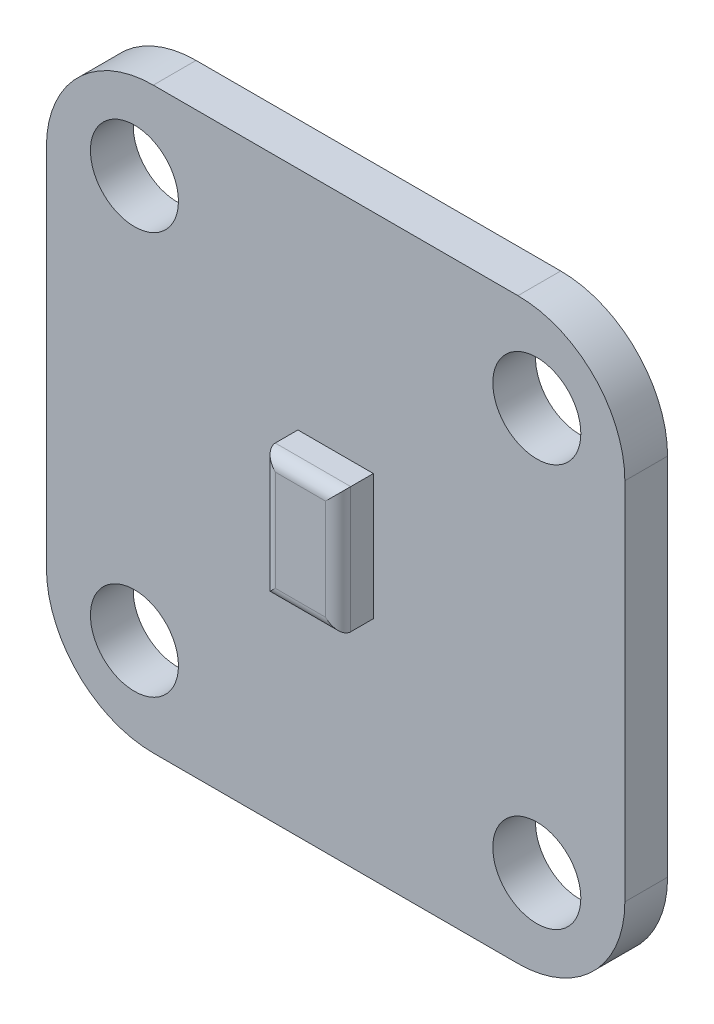
ISO-10303-21;
HEADER;
FILE_DESCRIPTION(('STEP AP214'),'2;1');
FILE_NAME('part.step','',(''),(''),'','','');
FILE_SCHEMA(('AUTOMOTIVE_DESIGN { 1 0 10303 214 1 1 1 1 }'));
ENDSEC;
DATA;
#1=APPLICATION_CONTEXT('core data for automotive mechanical design processes');
#2=APPLICATION_PROTOCOL_DEFINITION('international standard','automotive_design',2000,#1);
#3=PRODUCT_CONTEXT('',#1,'mechanical');
#4=PRODUCT('Part','Part','',(#3));
#5=PRODUCT_RELATED_PRODUCT_CATEGORY('part','',(#4));
#6=PRODUCT_DEFINITION_FORMATION('','',#4);
#7=PRODUCT_DEFINITION_CONTEXT('part definition',#1,'design');
#8=PRODUCT_DEFINITION('design','',#6,#7);
#9=PRODUCT_DEFINITION_SHAPE('','',#8);
#10=(LENGTH_UNIT() NAMED_UNIT(*) SI_UNIT(.MILLI.,.METRE.));
#11=(NAMED_UNIT(*) PLANE_ANGLE_UNIT() SI_UNIT($,.RADIAN.));
#12=(NAMED_UNIT(*) SI_UNIT($,.STERADIAN.) SOLID_ANGLE_UNIT());
#13=UNCERTAINTY_MEASURE_WITH_UNIT(LENGTH_MEASURE(1.E-05),#10,'distance_accuracy_value','');
#14=(GEOMETRIC_REPRESENTATION_CONTEXT(3) GLOBAL_UNCERTAINTY_ASSIGNED_CONTEXT((#13)) GLOBAL_UNIT_ASSIGNED_CONTEXT((#10,
#11,#12)) REPRESENTATION_CONTEXT('',''));
#15=CARTESIAN_POINT('',(0.,0.,0.));
#16=DIRECTION('',(0.,0.,1.));
#17=DIRECTION('',(1.,0.,0.));
#18=AXIS2_PLACEMENT_3D('',#15,#16,#17);
#19=CARTESIAN_POINT('',(0.,-11.5,1.7));
#20=DIRECTION('',(0.,1.,0.));
#21=DIRECTION('',(0.,0.,1.));
#22=AXIS2_PLACEMENT_3D('',#19,#20,#21);
#23=PLANE('',#22);
#24=DIRECTION('',(1.,0.,0.));
#25=VECTOR('',#24,1.);
#26=CARTESIAN_POINT('',(0.,-11.5,0.));
#27=LINE('',#26,#25);
#28=CARTESIAN_POINT('',(-7.25,-11.5,0.));
#29=VERTEX_POINT('',#28);
#30=CARTESIAN_POINT('',(7.25,-11.5,0.));
#31=VERTEX_POINT('',#30);
#32=EDGE_CURVE('E203',#29,#31,#27,.T.);
#33=ORIENTED_EDGE('',*,*,#32,.T.);
#34=DIRECTION('',(0.,0.,-1.));
#35=VECTOR('',#34,1.);
#36=CARTESIAN_POINT('',(7.25,-11.5,1.7));
#37=LINE('',#36,#35);
#38=CARTESIAN_POINT('',(7.25,-11.5,1.7));
#39=VERTEX_POINT('',#38);
#40=EDGE_CURVE('E246',#31,#39,#37,.F.);
#41=ORIENTED_EDGE('',*,*,#40,.T.);
#42=DIRECTION('',(1.,0.,0.));
#43=VECTOR('',#42,1.);
#44=CARTESIAN_POINT('',(0.,-11.5,1.7));
#45=LINE('',#44,#43);
#46=CARTESIAN_POINT('',(-7.25,-11.5,1.7));
#47=VERTEX_POINT('',#46);
#48=EDGE_CURVE('E182',#47,#39,#45,.T.);
#49=ORIENTED_EDGE('',*,*,#48,.F.);
#50=DIRECTION('',(0.,0.,-1.));
#51=VECTOR('',#50,1.);
#52=CARTESIAN_POINT('',(-7.25,-11.5,0.));
#53=LINE('',#52,#51);
#54=EDGE_CURVE('E232',#47,#29,#53,.T.);
#55=ORIENTED_EDGE('',*,*,#54,.T.);
#56=EDGE_LOOP('',(#33,#41,#49,#55));
#57=FACE_BOUND('',#56,.T.);
#58=ADVANCED_FACE('F34',(#57),#23,.F.);
#59=CARTESIAN_POINT('',(11.5,0.,1.7));
#60=DIRECTION('',(-1.,0.,0.));
#61=DIRECTION('',(0.,0.,1.));
#62=AXIS2_PLACEMENT_3D('',#59,#60,#61);
#63=PLANE('',#62);
#64=DIRECTION('',(0.,1.,0.));
#65=VECTOR('',#64,1.);
#66=CARTESIAN_POINT('',(11.5,0.,1.7));
#67=LINE('',#66,#65);
#68=CARTESIAN_POINT('',(11.5,-7.25,1.7));
#69=VERTEX_POINT('',#68);
#70=CARTESIAN_POINT('',(11.5,7.25,1.7));
#71=VERTEX_POINT('',#70);
#72=EDGE_CURVE('E185',#69,#71,#67,.T.);
#73=ORIENTED_EDGE('',*,*,#72,.F.);
#74=DIRECTION('',(0.,0.,-1.));
#75=VECTOR('',#74,1.);
#76=CARTESIAN_POINT('',(11.5,-7.25,1.7));
#77=LINE('',#76,#75);
#78=CARTESIAN_POINT('',(11.5,-7.25,0.));
#79=VERTEX_POINT('',#78);
#80=EDGE_CURVE('E241',#69,#79,#77,.T.);
#81=ORIENTED_EDGE('',*,*,#80,.T.);
#82=DIRECTION('',(0.,1.,0.));
#83=VECTOR('',#82,1.);
#84=CARTESIAN_POINT('',(11.5,0.,0.));
#85=LINE('',#84,#83);
#86=CARTESIAN_POINT('',(11.5,7.25,0.));
#87=VERTEX_POINT('',#86);
#88=EDGE_CURVE('E206',#79,#87,#85,.T.);
#89=ORIENTED_EDGE('',*,*,#88,.T.);
#90=DIRECTION('',(0.,0.,-1.));
#91=VECTOR('',#90,1.);
#92=CARTESIAN_POINT('',(11.5,7.25,1.7));
#93=LINE('',#92,#91);
#94=EDGE_CURVE('E216',#87,#71,#93,.F.);
#95=ORIENTED_EDGE('',*,*,#94,.T.);
#96=EDGE_LOOP('',(#73,#81,#89,#95));
#97=FACE_BOUND('',#96,.T.);
#98=ADVANCED_FACE('F300',(#97),#63,.F.);
#99=CARTESIAN_POINT('',(0.,11.5,1.7));
#100=DIRECTION('',(0.,1.,0.));
#101=DIRECTION('',(0.,0.,1.));
#102=AXIS2_PLACEMENT_3D('',#99,#100,#101);
#103=PLANE('',#102);
#104=DIRECTION('',(1.,0.,0.));
#105=VECTOR('',#104,1.);
#106=CARTESIAN_POINT('',(0.,11.5,0.));
#107=LINE('',#106,#105);
#108=CARTESIAN_POINT('',(-7.25,11.5,0.));
#109=VERTEX_POINT('',#108);
#110=CARTESIAN_POINT('',(7.25,11.5,0.));
#111=VERTEX_POINT('',#110);
#112=EDGE_CURVE('E208',#109,#111,#107,.T.);
#113=ORIENTED_EDGE('',*,*,#112,.F.);
#114=DIRECTION('',(0.,0.,-1.));
#115=VECTOR('',#114,1.);
#116=CARTESIAN_POINT('',(-7.25,11.5,1.7));
#117=LINE('',#116,#115);
#118=CARTESIAN_POINT('',(-7.25,11.5,1.7));
#119=VERTEX_POINT('',#118);
#120=EDGE_CURVE('E227',#109,#119,#117,.F.);
#121=ORIENTED_EDGE('',*,*,#120,.T.);
#122=DIRECTION('',(1.,0.,0.));
#123=VECTOR('',#122,1.);
#124=CARTESIAN_POINT('',(0.,11.5,1.7));
#125=LINE('',#124,#123);
#126=CARTESIAN_POINT('',(7.25,11.5,1.7));
#127=VERTEX_POINT('',#126);
#128=EDGE_CURVE('E187',#119,#127,#125,.T.);
#129=ORIENTED_EDGE('',*,*,#128,.T.);
#130=DIRECTION('',(0.,0.,-1.));
#131=VECTOR('',#130,1.);
#132=CARTESIAN_POINT('',(7.25,11.5,0.));
#133=LINE('',#132,#131);
#134=EDGE_CURVE('E191',#127,#111,#133,.T.);
#135=ORIENTED_EDGE('',*,*,#134,.T.);
#136=EDGE_LOOP('',(#113,#121,#129,#135));
#137=FACE_BOUND('',#136,.T.);
#138=ADVANCED_FACE('F306',(#137),#103,.T.);
#139=CARTESIAN_POINT('',(-8.,8.,1.7));
#140=DIRECTION('',(0.,0.,-1.));
#141=DIRECTION('',(-1.,0.,0.));
#142=AXIS2_PLACEMENT_3D('',#139,#140,#141);
#143=CYLINDRICAL_SURFACE('',#142,1.75);
#144=CARTESIAN_POINT('',(-8.,8.,1.7));
#145=DIRECTION('',(0.,0.,1.));
#146=DIRECTION('',(1.,0.,0.));
#147=AXIS2_PLACEMENT_3D('',#144,#145,#146);
#148=CIRCLE('',#147,1.75);
#149=CARTESIAN_POINT('',(-6.25,8.,1.7));
#150=VERTEX_POINT('',#149);
#151=EDGE_CURVE('E179',#150,#150,#148,.T.);
#152=ORIENTED_EDGE('',*,*,#151,.T.);
#153=EDGE_LOOP('',(#152));
#154=FACE_BOUND('',#153,.T.);
#155=CARTESIAN_POINT('',(-8.,8.,0.));
#156=DIRECTION('',(0.,0.,1.));
#157=DIRECTION('',(1.,0.,0.));
#158=AXIS2_PLACEMENT_3D('',#155,#156,#157);
#159=CIRCLE('',#158,1.75);
#160=CARTESIAN_POINT('',(-6.25,8.,0.));
#161=VERTEX_POINT('',#160);
#162=EDGE_CURVE('E200',#161,#161,#159,.T.);
#163=ORIENTED_EDGE('',*,*,#162,.F.);
#164=EDGE_LOOP('',(#163));
#165=FACE_BOUND('',#164,.T.);
#166=ADVANCED_FACE('F311',(#154,#165),#143,.F.);
#167=CARTESIAN_POINT('',(8.,-8.,1.7));
#168=DIRECTION('',(0.,0.,-1.));
#169=DIRECTION('',(-1.,0.,0.));
#170=AXIS2_PLACEMENT_3D('',#167,#168,#169);
#171=CYLINDRICAL_SURFACE('',#170,1.75);
#172=CARTESIAN_POINT('',(8.,-8.,1.7));
#173=DIRECTION('',(0.,0.,1.));
#174=DIRECTION('',(1.,0.,0.));
#175=AXIS2_PLACEMENT_3D('',#172,#173,#174);
#176=CIRCLE('',#175,1.75);
#177=CARTESIAN_POINT('',(9.75,-8.,1.7));
#178=VERTEX_POINT('',#177);
#179=EDGE_CURVE('E176',#178,#178,#176,.T.);
#180=ORIENTED_EDGE('',*,*,#179,.T.);
#181=EDGE_LOOP('',(#180));
#182=FACE_BOUND('',#181,.T.);
#183=CARTESIAN_POINT('',(8.,-8.,0.));
#184=DIRECTION('',(0.,0.,1.));
#185=DIRECTION('',(1.,0.,0.));
#186=AXIS2_PLACEMENT_3D('',#183,#184,#185);
#187=CIRCLE('',#186,1.75);
#188=CARTESIAN_POINT('',(9.75,-8.,0.));
#189=VERTEX_POINT('',#188);
#190=EDGE_CURVE('E197',#189,#189,#187,.T.);
#191=ORIENTED_EDGE('',*,*,#190,.F.);
#192=EDGE_LOOP('',(#191));
#193=FACE_BOUND('',#192,.T.);
#194=ADVANCED_FACE('F314',(#182,#193),#171,.F.);
#195=CARTESIAN_POINT('',(8.,8.,1.7));
#196=DIRECTION('',(0.,0.,-1.));
#197=DIRECTION('',(-1.,0.,0.));
#198=AXIS2_PLACEMENT_3D('',#195,#196,#197);
#199=CYLINDRICAL_SURFACE('',#198,1.75);
#200=CARTESIAN_POINT('',(8.,8.,1.7));
#201=DIRECTION('',(0.,0.,1.));
#202=DIRECTION('',(1.,0.,0.));
#203=AXIS2_PLACEMENT_3D('',#200,#201,#202);
#204=CIRCLE('',#203,1.75);
#205=CARTESIAN_POINT('',(9.75,8.,1.7));
#206=VERTEX_POINT('',#205);
#207=EDGE_CURVE('E172',#206,#206,#204,.T.);
#208=ORIENTED_EDGE('',*,*,#207,.T.);
#209=EDGE_LOOP('',(#208));
#210=FACE_BOUND('',#209,.T.);
#211=CARTESIAN_POINT('',(8.,8.,0.));
#212=DIRECTION('',(0.,0.,1.));
#213=DIRECTION('',(1.,0.,0.));
#214=AXIS2_PLACEMENT_3D('',#211,#212,#213);
#215=CIRCLE('',#214,1.75);
#216=CARTESIAN_POINT('',(9.75,8.,0.));
#217=VERTEX_POINT('',#216);
#218=EDGE_CURVE('E194',#217,#217,#215,.T.);
#219=ORIENTED_EDGE('',*,*,#218,.F.);
#220=EDGE_LOOP('',(#219));
#221=FACE_BOUND('',#220,.T.);
#222=ADVANCED_FACE('F318',(#210,#221),#199,.F.);
#223=CARTESIAN_POINT('',(-8.,-8.,1.7));
#224=DIRECTION('',(0.,0.,-1.));
#225=DIRECTION('',(-1.,0.,0.));
#226=AXIS2_PLACEMENT_3D('',#223,#224,#225);
#227=CYLINDRICAL_SURFACE('',#226,1.75);
#228=CARTESIAN_POINT('',(-8.,-8.,1.7));
#229=DIRECTION('',(0.,0.,1.));
#230=DIRECTION('',(1.,0.,0.));
#231=AXIS2_PLACEMENT_3D('',#228,#229,#230);
#232=CIRCLE('',#231,1.75);
#233=CARTESIAN_POINT('',(-6.25,-8.,1.7));
#234=VERTEX_POINT('',#233);
#235=EDGE_CURVE('E169',#234,#234,#232,.T.);
#236=ORIENTED_EDGE('',*,*,#235,.T.);
#237=EDGE_LOOP('',(#236));
#238=FACE_BOUND('',#237,.T.);
#239=CARTESIAN_POINT('',(-8.,-8.,0.));
#240=DIRECTION('',(0.,0.,1.));
#241=DIRECTION('',(1.,0.,0.));
#242=AXIS2_PLACEMENT_3D('',#239,#240,#241);
#243=CIRCLE('',#242,1.75);
#244=CARTESIAN_POINT('',(-6.25,-8.,0.));
#245=VERTEX_POINT('',#244);
#246=EDGE_CURVE('E157',#245,#245,#243,.T.);
#247=ORIENTED_EDGE('',*,*,#246,.F.);
#248=EDGE_LOOP('',(#247));
#249=FACE_BOUND('',#248,.T.);
#250=ADVANCED_FACE('F322',(#238,#249),#227,.F.);
#251=CARTESIAN_POINT('',(-11.5,0.,1.7));
#252=DIRECTION('',(-1.,0.,0.));
#253=DIRECTION('',(0.,0.,1.));
#254=AXIS2_PLACEMENT_3D('',#251,#252,#253);
#255=PLANE('',#254);
#256=DIRECTION('',(0.,1.,0.));
#257=VECTOR('',#256,1.);
#258=CARTESIAN_POINT('',(-11.5,0.,0.));
#259=LINE('',#258,#257);
#260=CARTESIAN_POINT('',(-11.5,-7.25,0.));
#261=VERTEX_POINT('',#260);
#262=CARTESIAN_POINT('',(-11.5,7.25,0.));
#263=VERTEX_POINT('',#262);
#264=EDGE_CURVE('E173',#261,#263,#259,.T.);
#265=ORIENTED_EDGE('',*,*,#264,.F.);
#266=DIRECTION('',(0.,0.,-1.));
#267=VECTOR('',#266,1.);
#268=CARTESIAN_POINT('',(-11.5,-7.25,1.7));
#269=LINE('',#268,#267);
#270=CARTESIAN_POINT('',(-11.5,-7.25,1.7));
#271=VERTEX_POINT('',#270);
#272=EDGE_CURVE('E237',#261,#271,#269,.F.);
#273=ORIENTED_EDGE('',*,*,#272,.T.);
#274=DIRECTION('',(0.,1.,0.));
#275=VECTOR('',#274,1.);
#276=CARTESIAN_POINT('',(-11.5,0.,1.7));
#277=LINE('',#276,#275);
#278=CARTESIAN_POINT('',(-11.5,7.25,1.7));
#279=VERTEX_POINT('',#278);
#280=EDGE_CURVE('E189',#271,#279,#277,.T.);
#281=ORIENTED_EDGE('',*,*,#280,.T.);
#282=DIRECTION('',(0.,0.,-1.));
#283=VECTOR('',#282,1.);
#284=CARTESIAN_POINT('',(-11.5,7.25,1.7));
#285=LINE('',#284,#283);
#286=EDGE_CURVE('E222',#279,#263,#285,.T.);
#287=ORIENTED_EDGE('',*,*,#286,.T.);
#288=EDGE_LOOP('',(#265,#273,#281,#287));
#289=FACE_BOUND('',#288,.T.);
#290=ADVANCED_FACE('F326',(#289),#255,.T.);
#291=CARTESIAN_POINT('',(0.,0.,1.7));
#292=DIRECTION('',(0.,0.,1.));
#293=DIRECTION('',(1.,0.,0.));
#294=AXIS2_PLACEMENT_3D('',#291,#292,#293);
#295=PLANE('',#294);
#296=DIRECTION('',(-1.,0.,0.));
#297=VECTOR('',#296,1.);
#298=CARTESIAN_POINT('',(0.,2.5,1.7));
#299=LINE('',#298,#297);
#300=CARTESIAN_POINT('',(1.5,2.5,1.7));
#301=VERTEX_POINT('',#300);
#302=CARTESIAN_POINT('',(-1.5,2.5,1.7));
#303=VERTEX_POINT('',#302);
#304=EDGE_CURVE('E139',#301,#303,#299,.T.);
#305=ORIENTED_EDGE('',*,*,#304,.F.);
#306=DIRECTION('',(0.,1.,0.));
#307=VECTOR('',#306,1.);
#308=CARTESIAN_POINT('',(1.5,0.,1.7));
#309=LINE('',#308,#307);
#310=CARTESIAN_POINT('',(1.5,-2.5,1.7));
#311=VERTEX_POINT('',#310);
#312=EDGE_CURVE('E153',#311,#301,#309,.T.);
#313=ORIENTED_EDGE('',*,*,#312,.F.);
#314=DIRECTION('',(-1.,0.,0.));
#315=VECTOR('',#314,1.);
#316=CARTESIAN_POINT('',(0.,-2.5,1.7));
#317=LINE('',#316,#315);
#318=CARTESIAN_POINT('',(-1.5,-2.5,1.7));
#319=VERTEX_POINT('',#318);
#320=EDGE_CURVE('E160',#311,#319,#317,.T.);
#321=ORIENTED_EDGE('',*,*,#320,.T.);
#322=DIRECTION('',(0.,1.,0.));
#323=VECTOR('',#322,1.);
#324=CARTESIAN_POINT('',(-1.5,0.,1.7));
#325=LINE('',#324,#323);
#326=EDGE_CURVE('E156',#319,#303,#325,.T.);
#327=ORIENTED_EDGE('',*,*,#326,.T.);
#328=EDGE_LOOP('',(#305,#313,#321,#327));
#329=FACE_BOUND('',#328,.T.);
#330=ORIENTED_EDGE('',*,*,#235,.F.);
#331=EDGE_LOOP('',(#330));
#332=FACE_BOUND('',#331,.T.);
#333=ORIENTED_EDGE('',*,*,#207,.F.);
#334=EDGE_LOOP('',(#333));
#335=FACE_BOUND('',#334,.T.);
#336=ORIENTED_EDGE('',*,*,#179,.F.);
#337=EDGE_LOOP('',(#336));
#338=FACE_BOUND('',#337,.T.);
#339=ORIENTED_EDGE('',*,*,#151,.F.);
#340=EDGE_LOOP('',(#339));
#341=FACE_BOUND('',#340,.T.);
#342=ORIENTED_EDGE('',*,*,#48,.T.);
#343=CARTESIAN_POINT('',(7.25,-7.25,1.7));
#344=DIRECTION('',(0.,0.,1.));
#345=DIRECTION('',(1.,0.,0.));
#346=AXIS2_PLACEMENT_3D('',#343,#344,#345);
#347=CIRCLE('',#346,4.25);
#348=EDGE_CURVE('E248',#39,#69,#347,.T.);
#349=ORIENTED_EDGE('',*,*,#348,.T.);
#350=ORIENTED_EDGE('',*,*,#72,.T.);
#351=CARTESIAN_POINT('',(7.25,7.25,1.7));
#352=DIRECTION('',(0.,0.,1.));
#353=DIRECTION('',(1.,0.,0.));
#354=AXIS2_PLACEMENT_3D('',#351,#352,#353);
#355=CIRCLE('',#354,4.25);
#356=EDGE_CURVE('E219',#71,#127,#355,.T.);
#357=ORIENTED_EDGE('',*,*,#356,.T.);
#358=ORIENTED_EDGE('',*,*,#128,.F.);
#359=CARTESIAN_POINT('',(-7.25,7.25,1.7));
#360=DIRECTION('',(0.,0.,1.));
#361=DIRECTION('',(1.,0.,0.));
#362=AXIS2_PLACEMENT_3D('',#359,#360,#361);
#363=CIRCLE('',#362,4.25);
#364=EDGE_CURVE('E229',#119,#279,#363,.T.);
#365=ORIENTED_EDGE('',*,*,#364,.T.);
#366=ORIENTED_EDGE('',*,*,#280,.F.);
#367=CARTESIAN_POINT('',(-7.25,-7.25,1.7));
#368=DIRECTION('',(0.,0.,1.));
#369=DIRECTION('',(1.,0.,0.));
#370=AXIS2_PLACEMENT_3D('',#367,#368,#369);
#371=CIRCLE('',#370,4.25);
#372=EDGE_CURVE('E239',#271,#47,#371,.T.);
#373=ORIENTED_EDGE('',*,*,#372,.T.);
#374=EDGE_LOOP('',(#342,#349,#350,#357,#358,#365,#366,#373));
#375=FACE_BOUND('',#374,.T.);
#376=ADVANCED_FACE('F150',(#329,#332,#335,#338,#341,#375),#295,.T.);
#377=CARTESIAN_POINT('',(0.,0.,0.));
#378=DIRECTION('',(0.,0.,1.));
#379=DIRECTION('',(1.,0.,0.));
#380=AXIS2_PLACEMENT_3D('',#377,#378,#379);
#381=PLANE('',#380);
#382=ORIENTED_EDGE('',*,*,#246,.T.);
#383=EDGE_LOOP('',(#382));
#384=FACE_BOUND('',#383,.T.);
#385=ORIENTED_EDGE('',*,*,#218,.T.);
#386=EDGE_LOOP('',(#385));
#387=FACE_BOUND('',#386,.T.);
#388=ORIENTED_EDGE('',*,*,#190,.T.);
#389=EDGE_LOOP('',(#388));
#390=FACE_BOUND('',#389,.T.);
#391=ORIENTED_EDGE('',*,*,#162,.T.);
#392=EDGE_LOOP('',(#391));
#393=FACE_BOUND('',#392,.T.);
#394=ORIENTED_EDGE('',*,*,#88,.F.);
#395=CARTESIAN_POINT('',(7.25,-7.25,0.));
#396=DIRECTION('',(0.,0.,1.));
#397=DIRECTION('',(1.,0.,0.));
#398=AXIS2_PLACEMENT_3D('',#395,#396,#397);
#399=CIRCLE('',#398,4.25);
#400=EDGE_CURVE('E244',#79,#31,#399,.F.);
#401=ORIENTED_EDGE('',*,*,#400,.T.);
#402=ORIENTED_EDGE('',*,*,#32,.F.);
#403=CARTESIAN_POINT('',(-7.25,-7.25,0.));
#404=DIRECTION('',(0.,0.,1.));
#405=DIRECTION('',(1.,0.,0.));
#406=AXIS2_PLACEMENT_3D('',#403,#404,#405);
#407=CIRCLE('',#406,4.25);
#408=EDGE_CURVE('E235',#29,#261,#407,.F.);
#409=ORIENTED_EDGE('',*,*,#408,.T.);
#410=ORIENTED_EDGE('',*,*,#264,.T.);
#411=CARTESIAN_POINT('',(-7.25,7.25,0.));
#412=DIRECTION('',(0.,0.,1.));
#413=DIRECTION('',(1.,0.,0.));
#414=AXIS2_PLACEMENT_3D('',#411,#412,#413);
#415=CIRCLE('',#414,4.25);
#416=EDGE_CURVE('E225',#263,#109,#415,.F.);
#417=ORIENTED_EDGE('',*,*,#416,.T.);
#418=ORIENTED_EDGE('',*,*,#112,.T.);
#419=CARTESIAN_POINT('',(7.25,7.25,0.));
#420=DIRECTION('',(0.,0.,1.));
#421=DIRECTION('',(1.,0.,0.));
#422=AXIS2_PLACEMENT_3D('',#419,#420,#421);
#423=CIRCLE('',#422,4.25);
#424=EDGE_CURVE('E213',#111,#87,#423,.F.);
#425=ORIENTED_EDGE('',*,*,#424,.T.);
#426=EDGE_LOOP('',(#394,#401,#402,#409,#410,#417,#418,#425));
#427=FACE_BOUND('',#426,.T.);
#428=ADVANCED_FACE('F296',(#384,#387,#390,#393,#427),#381,.F.);
#429=CARTESIAN_POINT('',(-1.5,2.5,3.1));
#430=DIRECTION('',(0.,1.,0.));
#431=DIRECTION('',(0.,0.,1.));
#432=AXIS2_PLACEMENT_3D('',#429,#430,#431);
#433=PLANE('',#432);
#434=DIRECTION('',(0.,0.,-1.));
#435=VECTOR('',#434,1.);
#436=CARTESIAN_POINT('',(-1.5,2.5,3.1));
#437=LINE('',#436,#435);
#438=CARTESIAN_POINT('',(-1.5,2.5,2.6));
#439=VERTEX_POINT('',#438);
#440=EDGE_CURVE('E161',#439,#303,#437,.T.);
#441=ORIENTED_EDGE('',*,*,#440,.F.);
#442=DIRECTION('',(1.,0.,0.));
#443=VECTOR('',#442,1.);
#444=CARTESIAN_POINT('',(1.5,2.5,2.6));
#445=LINE('',#444,#443);
#446=CARTESIAN_POINT('',(1.5,2.5,2.6));
#447=VERTEX_POINT('',#446);
#448=EDGE_CURVE('E11',#439,#447,#445,.T.);
#449=ORIENTED_EDGE('',*,*,#448,.T.);
#450=DIRECTION('',(0.,0.,-1.));
#451=VECTOR('',#450,1.);
#452=CARTESIAN_POINT('',(1.5,2.5,3.1));
#453=LINE('',#452,#451);
#454=EDGE_CURVE('E136',#447,#301,#453,.T.);
#455=ORIENTED_EDGE('',*,*,#454,.T.);
#456=ORIENTED_EDGE('',*,*,#304,.T.);
#457=EDGE_LOOP('',(#441,#449,#455,#456));
#458=FACE_BOUND('',#457,.T.);
#459=ADVANCED_FACE('F138',(#458),#433,.T.);
#460=CARTESIAN_POINT('',(-1.5,2.5,3.1));
#461=DIRECTION('',(1.,0.,0.));
#462=DIRECTION('',(0.,1.,0.));
#463=AXIS2_PLACEMENT_3D('',#460,#461,#462);
#464=PLANE('',#463);
#465=DIRECTION('',(0.,0.,-1.));
#466=VECTOR('',#465,1.);
#467=CARTESIAN_POINT('',(-1.5,-2.5,3.1));
#468=LINE('',#467,#466);
#469=CARTESIAN_POINT('',(-1.5,-2.5,2.6));
#470=VERTEX_POINT('',#469);
#471=EDGE_CURVE('E164',#470,#319,#468,.T.);
#472=ORIENTED_EDGE('',*,*,#471,.F.);
#473=DIRECTION('',(0.,-1.,0.));
#474=VECTOR('',#473,1.);
#475=CARTESIAN_POINT('',(-1.5,2.5,2.6));
#476=LINE('',#475,#474);
#477=EDGE_CURVE('E43',#470,#439,#476,.F.);
#478=ORIENTED_EDGE('',*,*,#477,.T.);
#479=ORIENTED_EDGE('',*,*,#440,.T.);
#480=ORIENTED_EDGE('',*,*,#326,.F.);
#481=EDGE_LOOP('',(#472,#478,#479,#480));
#482=FACE_BOUND('',#481,.T.);
#483=ADVANCED_FACE('F288',(#482),#464,.F.);
#484=CARTESIAN_POINT('',(-1.5,-2.5,3.1));
#485=DIRECTION('',(0.,1.,0.));
#486=DIRECTION('',(0.,0.,1.));
#487=AXIS2_PLACEMENT_3D('',#484,#485,#486);
#488=PLANE('',#487);
#489=DIRECTION('',(0.,0.,-1.));
#490=VECTOR('',#489,1.);
#491=CARTESIAN_POINT('',(1.5,-2.5,3.1));
#492=LINE('',#491,#490);
#493=CARTESIAN_POINT('',(1.5,-2.5,2.6));
#494=VERTEX_POINT('',#493);
#495=EDGE_CURVE('E145',#494,#311,#492,.T.);
#496=ORIENTED_EDGE('',*,*,#495,.F.);
#497=DIRECTION('',(1.,0.,0.));
#498=VECTOR('',#497,1.);
#499=CARTESIAN_POINT('',(-1.5,-2.5,2.6));
#500=LINE('',#499,#498);
#501=EDGE_CURVE('E58',#494,#470,#500,.F.);
#502=ORIENTED_EDGE('',*,*,#501,.T.);
#503=ORIENTED_EDGE('',*,*,#471,.T.);
#504=ORIENTED_EDGE('',*,*,#320,.F.);
#505=EDGE_LOOP('',(#496,#502,#503,#504));
#506=FACE_BOUND('',#505,.T.);
#507=ADVANCED_FACE('F286',(#506),#488,.F.);
#508=CARTESIAN_POINT('',(1.5,2.5,3.1));
#509=DIRECTION('',(1.,0.,0.));
#510=DIRECTION('',(0.,1.,0.));
#511=AXIS2_PLACEMENT_3D('',#508,#509,#510);
#512=PLANE('',#511);
#513=ORIENTED_EDGE('',*,*,#454,.F.);
#514=DIRECTION('',(0.,-1.,0.));
#515=VECTOR('',#514,1.);
#516=CARTESIAN_POINT('',(1.5,-2.5,2.6));
#517=LINE('',#516,#515);
#518=EDGE_CURVE('E250',#447,#494,#517,.T.);
#519=ORIENTED_EDGE('',*,*,#518,.T.);
#520=ORIENTED_EDGE('',*,*,#495,.T.);
#521=ORIENTED_EDGE('',*,*,#312,.T.);
#522=EDGE_LOOP('',(#513,#519,#520,#521));
#523=FACE_BOUND('',#522,.T.);
#524=ADVANCED_FACE('F159',(#523),#512,.T.);
#525=CARTESIAN_POINT('',(0.,0.,3.1));
#526=DIRECTION('',(0.,0.,-1.));
#527=DIRECTION('',(-1.,0.,0.));
#528=AXIS2_PLACEMENT_3D('',#525,#526,#527);
#529=PLANE('',#528);
#530=DIRECTION('',(1.,0.,0.));
#531=VECTOR('',#530,1.);
#532=CARTESIAN_POINT('',(0.,-2.,3.1));
#533=LINE('',#532,#531);
#534=CARTESIAN_POINT('',(-1.,-2.,3.1));
#535=VERTEX_POINT('',#534);
#536=CARTESIAN_POINT('',(0.999999999999999,-2.,3.1));
#537=VERTEX_POINT('',#536);
#538=EDGE_CURVE('E256',#535,#537,#533,.T.);
#539=ORIENTED_EDGE('',*,*,#538,.T.);
#540=DIRECTION('',(0.,-1.,0.));
#541=VECTOR('',#540,1.);
#542=CARTESIAN_POINT('',(0.999999999999998,2.5,3.1));
#543=LINE('',#542,#541);
#544=CARTESIAN_POINT('',(0.999999999999998,2.,3.1));
#545=VERTEX_POINT('',#544);
#546=EDGE_CURVE('E258',#537,#545,#543,.F.);
#547=ORIENTED_EDGE('',*,*,#546,.T.);
#548=DIRECTION('',(1.,0.,0.));
#549=VECTOR('',#548,1.);
#550=CARTESIAN_POINT('',(-1.5,2.,3.1));
#551=LINE('',#550,#549);
#552=CARTESIAN_POINT('',(-1.,2.,3.1));
#553=VERTEX_POINT('',#552);
#554=EDGE_CURVE('E252',#545,#553,#551,.F.);
#555=ORIENTED_EDGE('',*,*,#554,.T.);
#556=DIRECTION('',(0.,-1.,0.));
#557=VECTOR('',#556,1.);
#558=CARTESIAN_POINT('',(-1.,0.,3.1));
#559=LINE('',#558,#557);
#560=EDGE_CURVE('E254',#553,#535,#559,.T.);
#561=ORIENTED_EDGE('',*,*,#560,.T.);
#562=EDGE_LOOP('',(#539,#547,#555,#561));
#563=FACE_BOUND('',#562,.T.);
#564=ADVANCED_FACE('F279',(#563),#529,.F.);
#565=CARTESIAN_POINT('',(7.25,7.25,1.7));
#566=DIRECTION('',(0.,0.,1.));
#567=DIRECTION('',(1.,0.,0.));
#568=AXIS2_PLACEMENT_3D('',#565,#566,#567);
#569=CYLINDRICAL_SURFACE('',#568,4.25);
#570=ORIENTED_EDGE('',*,*,#356,.F.);
#571=ORIENTED_EDGE('',*,*,#94,.F.);
#572=ORIENTED_EDGE('',*,*,#424,.F.);
#573=ORIENTED_EDGE('',*,*,#134,.F.);
#574=EDGE_LOOP('',(#570,#571,#572,#573));
#575=FACE_BOUND('',#574,.T.);
#576=ADVANCED_FACE('F328',(#575),#569,.T.);
#577=CARTESIAN_POINT('',(-7.25,7.25,1.7));
#578=DIRECTION('',(0.,0.,-1.));
#579=DIRECTION('',(-1.,0.,0.));
#580=AXIS2_PLACEMENT_3D('',#577,#578,#579);
#581=CYLINDRICAL_SURFACE('',#580,4.25);
#582=ORIENTED_EDGE('',*,*,#364,.F.);
#583=ORIENTED_EDGE('',*,*,#120,.F.);
#584=ORIENTED_EDGE('',*,*,#416,.F.);
#585=ORIENTED_EDGE('',*,*,#286,.F.);
#586=EDGE_LOOP('',(#582,#583,#584,#585));
#587=FACE_BOUND('',#586,.T.);
#588=ADVANCED_FACE('F331',(#587),#581,.T.);
#589=CARTESIAN_POINT('',(-7.25,-7.25,1.7));
#590=DIRECTION('',(0.,0.,1.));
#591=DIRECTION('',(1.,0.,0.));
#592=AXIS2_PLACEMENT_3D('',#589,#590,#591);
#593=CYLINDRICAL_SURFACE('',#592,4.25);
#594=ORIENTED_EDGE('',*,*,#372,.F.);
#595=ORIENTED_EDGE('',*,*,#272,.F.);
#596=ORIENTED_EDGE('',*,*,#408,.F.);
#597=ORIENTED_EDGE('',*,*,#54,.F.);
#598=EDGE_LOOP('',(#594,#595,#596,#597));
#599=FACE_BOUND('',#598,.T.);
#600=ADVANCED_FACE('F335',(#599),#593,.T.);
#601=CARTESIAN_POINT('',(7.25,-7.25,1.7));
#602=DIRECTION('',(0.,0.,-1.));
#603=DIRECTION('',(-1.,0.,0.));
#604=AXIS2_PLACEMENT_3D('',#601,#602,#603);
#605=CYLINDRICAL_SURFACE('',#604,4.25);
#606=ORIENTED_EDGE('',*,*,#348,.F.);
#607=ORIENTED_EDGE('',*,*,#40,.F.);
#608=ORIENTED_EDGE('',*,*,#400,.F.);
#609=ORIENTED_EDGE('',*,*,#80,.F.);
#610=EDGE_LOOP('',(#606,#607,#608,#609));
#611=FACE_BOUND('',#610,.T.);
#612=ADVANCED_FACE('F339',(#611),#605,.T.);
#613=CARTESIAN_POINT('',(-1.,0.,2.6));
#614=DIRECTION('',(0.,-1.,0.));
#615=DIRECTION('',(1.,0.,0.));
#616=AXIS2_PLACEMENT_3D('',#613,#614,#615);
#617=CYLINDRICAL_SURFACE('',#616,0.5);
#618=CARTESIAN_POINT('',(-1.,-2.,2.6));
#619=DIRECTION('',(0.707106781186548,-0.707106781186547,0.));
#620=DIRECTION('',(-0.707106781186547,-0.707106781186548,0.));
#621=AXIS2_PLACEMENT_3D('',#618,#619,#620);
#622=ELLIPSE('',#621,0.707106781186547,0.5);
#623=EDGE_CURVE('E266',#535,#470,#622,.T.);
#624=ORIENTED_EDGE('',*,*,#623,.F.);
#625=ORIENTED_EDGE('',*,*,#560,.F.);
#626=CARTESIAN_POINT('',(-1.,2.,2.6));
#627=DIRECTION('',(-0.707106781186547,-0.707106781186548,0.));
#628=DIRECTION('',(-0.707106781186548,0.707106781186547,0.));
#629=AXIS2_PLACEMENT_3D('',#626,#627,#628);
#630=ELLIPSE('',#629,0.707106781186548,0.5);
#631=EDGE_CURVE('E38',#439,#553,#630,.F.);
#632=ORIENTED_EDGE('',*,*,#631,.F.);
#633=ORIENTED_EDGE('',*,*,#477,.F.);
#634=EDGE_LOOP('',(#624,#625,#632,#633));
#635=FACE_BOUND('',#634,.T.);
#636=ADVANCED_FACE('F36',(#635),#617,.T.);
#637=CARTESIAN_POINT('',(-1.5,2.,2.6));
#638=DIRECTION('',(-1.,0.,0.));
#639=DIRECTION('',(0.,0.,1.));
#640=AXIS2_PLACEMENT_3D('',#637,#638,#639);
#641=CYLINDRICAL_SURFACE('',#640,0.5);
#642=ORIENTED_EDGE('',*,*,#631,.T.);
#643=ORIENTED_EDGE('',*,*,#554,.F.);
#644=CARTESIAN_POINT('',(0.999999999999998,2.,2.6));
#645=DIRECTION('',(-0.707106781186547,0.707106781186547,0.));
#646=DIRECTION('',(-0.707106781186547,-0.707106781186548,0.));
#647=AXIS2_PLACEMENT_3D('',#644,#645,#646);
#648=ELLIPSE('',#647,0.707106781186547,0.5);
#649=EDGE_CURVE('E265',#447,#545,#648,.F.);
#650=ORIENTED_EDGE('',*,*,#649,.F.);
#651=ORIENTED_EDGE('',*,*,#448,.F.);
#652=EDGE_LOOP('',(#642,#643,#650,#651));
#653=FACE_BOUND('',#652,.T.);
#654=ADVANCED_FACE('F275',(#653),#641,.T.);
#655=CARTESIAN_POINT('',(0.,-2.,2.6));
#656=DIRECTION('',(1.,0.,0.));
#657=DIRECTION('',(0.,0.,-1.));
#658=AXIS2_PLACEMENT_3D('',#655,#656,#657);
#659=CYLINDRICAL_SURFACE('',#658,0.5);
#660=ORIENTED_EDGE('',*,*,#623,.T.);
#661=ORIENTED_EDGE('',*,*,#501,.F.);
#662=CARTESIAN_POINT('',(0.999999999999999,-2.,2.6));
#663=DIRECTION('',(0.707106781186547,0.707106781186548,0.));
#664=DIRECTION('',(0.707106781186547,-0.707106781186547,0.));
#665=AXIS2_PLACEMENT_3D('',#662,#663,#664);
#666=ELLIPSE('',#665,0.707106781186548,0.5);
#667=EDGE_CURVE('E263',#537,#494,#666,.T.);
#668=ORIENTED_EDGE('',*,*,#667,.F.);
#669=ORIENTED_EDGE('',*,*,#538,.F.);
#670=EDGE_LOOP('',(#660,#661,#668,#669));
#671=FACE_BOUND('',#670,.T.);
#672=ADVANCED_FACE('F285',(#671),#659,.T.);
#673=CARTESIAN_POINT('',(0.999999999999998,2.5,2.6));
#674=DIRECTION('',(0.,1.,0.));
#675=DIRECTION('',(-1.,0.,0.));
#676=AXIS2_PLACEMENT_3D('',#673,#674,#675);
#677=CYLINDRICAL_SURFACE('',#676,0.5);
#678=ORIENTED_EDGE('',*,*,#649,.T.);
#679=ORIENTED_EDGE('',*,*,#546,.F.);
#680=ORIENTED_EDGE('',*,*,#667,.T.);
#681=ORIENTED_EDGE('',*,*,#518,.F.);
#682=EDGE_LOOP('',(#678,#679,#680,#681));
#683=FACE_BOUND('',#682,.T.);
#684=ADVANCED_FACE('F283',(#683),#677,.T.);
#685=CLOSED_SHELL('',(#58,#98,#138,#166,#194,#222,#250,#290,#376,#428,#459,#483,#507,#524,#564,
#576,#588,#600,#612,#636,#654,#672,#684));
#686=MANIFOLD_SOLID_BREP('B2',#685);
#687=ADVANCED_BREP_SHAPE_REPRESENTATION('',(#18,#686),#14);
#688=SHAPE_DEFINITION_REPRESENTATION(#9,#687);
ENDSEC;
END-ISO-10303-21;
